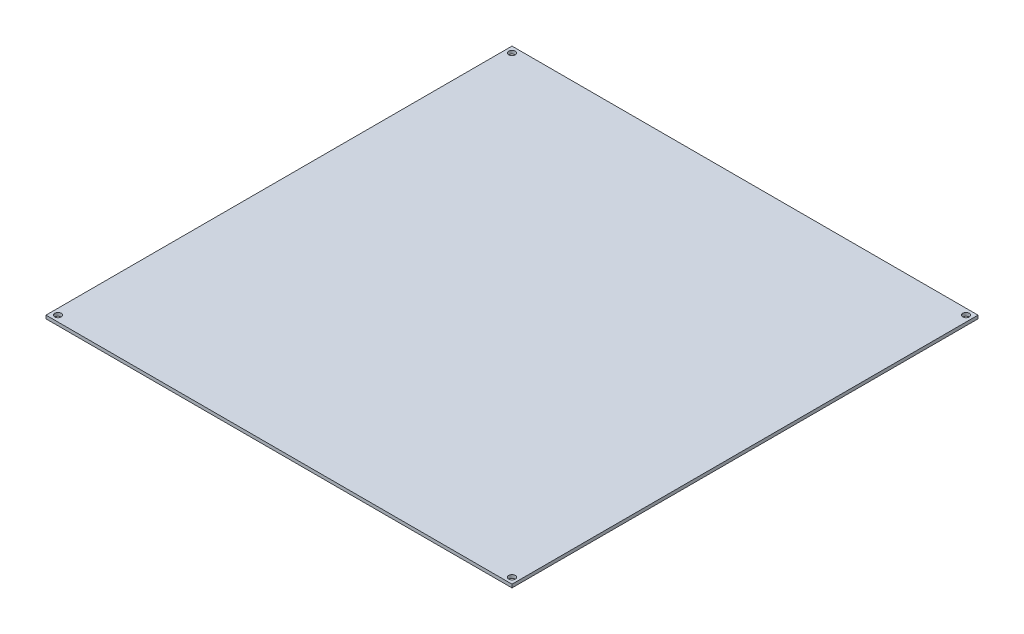
ISO-10303-21;
HEADER;
FILE_DESCRIPTION(('STEP AP214'),'2;1');
FILE_NAME('part.step','',(''),(''),'','','');
FILE_SCHEMA(('AUTOMOTIVE_DESIGN { 1 0 10303 214 1 1 1 1 }'));
ENDSEC;
DATA;
#1=APPLICATION_CONTEXT('core data for automotive mechanical design processes');
#2=APPLICATION_PROTOCOL_DEFINITION('international standard','automotive_design',2000,#1);
#3=PRODUCT_CONTEXT('',#1,'mechanical');
#4=PRODUCT('Part','Part','',(#3));
#5=PRODUCT_RELATED_PRODUCT_CATEGORY('part','',(#4));
#6=PRODUCT_DEFINITION_FORMATION('','',#4);
#7=PRODUCT_DEFINITION_CONTEXT('part definition',#1,'design');
#8=PRODUCT_DEFINITION('design','',#6,#7);
#9=PRODUCT_DEFINITION_SHAPE('','',#8);
#10=(LENGTH_UNIT() NAMED_UNIT(*) SI_UNIT(.MILLI.,.METRE.));
#11=(NAMED_UNIT(*) PLANE_ANGLE_UNIT() SI_UNIT($,.RADIAN.));
#12=(NAMED_UNIT(*) SI_UNIT($,.STERADIAN.) SOLID_ANGLE_UNIT());
#13=UNCERTAINTY_MEASURE_WITH_UNIT(LENGTH_MEASURE(1.E-05),#10,'distance_accuracy_value','');
#14=(GEOMETRIC_REPRESENTATION_CONTEXT(3) GLOBAL_UNCERTAINTY_ASSIGNED_CONTEXT((#13)) GLOBAL_UNIT_ASSIGNED_CONTEXT((#10,
#11,#12)) REPRESENTATION_CONTEXT('',''));
#15=CARTESIAN_POINT('',(0.,0.,0.));
#16=DIRECTION('',(0.,0.,1.));
#17=DIRECTION('',(1.,0.,0.));
#18=AXIS2_PLACEMENT_3D('',#15,#16,#17);
#19=CARTESIAN_POINT('',(0.,0.75,0.));
#20=DIRECTION('',(0.,1.,0.));
#21=DIRECTION('',(0.,0.,1.));
#22=AXIS2_PLACEMENT_3D('',#19,#20,#21);
#23=PLANE('',#22);
#24=CARTESIAN_POINT('',(104.25,0.75,104.25));
#25=DIRECTION('',(0.,1.,0.));
#26=DIRECTION('',(0.,0.,-1.));
#27=AXIS2_PLACEMENT_3D('',#24,#25,#26);
#28=CIRCLE('',#27,1.5);
#29=CARTESIAN_POINT('',(104.25,0.75,102.75));
#30=VERTEX_POINT('',#29);
#31=EDGE_CURVE('E123',#30,#30,#28,.T.);
#32=ORIENTED_EDGE('',*,*,#31,.F.);
#33=EDGE_LOOP('',(#32));
#34=FACE_BOUND('',#33,.T.);
#35=CARTESIAN_POINT('',(104.25,0.75,-104.25));
#36=DIRECTION('',(0.,1.,0.));
#37=DIRECTION('',(0.,0.,1.));
#38=AXIS2_PLACEMENT_3D('',#35,#36,#37);
#39=CIRCLE('',#38,1.5);
#40=CARTESIAN_POINT('',(104.25,0.75,-102.75));
#41=VERTEX_POINT('',#40);
#42=EDGE_CURVE('E102',#41,#41,#39,.T.);
#43=ORIENTED_EDGE('',*,*,#42,.F.);
#44=EDGE_LOOP('',(#43));
#45=FACE_BOUND('',#44,.T.);
#46=DIRECTION('',(0.,0.,-1.));
#47=VECTOR('',#46,1.);
#48=CARTESIAN_POINT('',(107.,0.75,-107.));
#49=LINE('',#48,#47);
#50=CARTESIAN_POINT('',(107.,0.75,107.));
#51=VERTEX_POINT('',#50);
#52=CARTESIAN_POINT('',(107.,0.75,-107.));
#53=VERTEX_POINT('',#52);
#54=EDGE_CURVE('E87',#51,#53,#49,.T.);
#55=ORIENTED_EDGE('',*,*,#54,.T.);
#56=DIRECTION('',(-1.,0.,0.));
#57=VECTOR('',#56,1.);
#58=CARTESIAN_POINT('',(-107.,0.75,-107.));
#59=LINE('',#58,#57);
#60=CARTESIAN_POINT('',(-107.,0.75,-107.));
#61=VERTEX_POINT('',#60);
#62=EDGE_CURVE('E82',#53,#61,#59,.T.);
#63=ORIENTED_EDGE('',*,*,#62,.T.);
#64=DIRECTION('',(0.,0.,1.));
#65=VECTOR('',#64,1.);
#66=CARTESIAN_POINT('',(-107.,0.75,-107.));
#67=LINE('',#66,#65);
#68=CARTESIAN_POINT('',(-107.,0.75,107.));
#69=VERTEX_POINT('',#68);
#70=EDGE_CURVE('E85',#61,#69,#67,.T.);
#71=ORIENTED_EDGE('',*,*,#70,.T.);
#72=DIRECTION('',(1.,0.,0.));
#73=VECTOR('',#72,1.);
#74=CARTESIAN_POINT('',(-107.,0.75,107.));
#75=LINE('',#74,#73);
#76=EDGE_CURVE('E52',#69,#51,#75,.T.);
#77=ORIENTED_EDGE('',*,*,#76,.T.);
#78=EDGE_LOOP('',(#55,#63,#71,#77));
#79=FACE_BOUND('',#78,.T.);
#80=CARTESIAN_POINT('',(-104.25,0.75,-104.25));
#81=DIRECTION('',(0.,1.,0.));
#82=DIRECTION('',(0.,0.,-1.));
#83=AXIS2_PLACEMENT_3D('',#80,#81,#82);
#84=CIRCLE('',#83,1.5);
#85=CARTESIAN_POINT('',(-104.25,0.75,-105.75));
#86=VERTEX_POINT('',#85);
#87=EDGE_CURVE('E117',#86,#86,#84,.T.);
#88=ORIENTED_EDGE('',*,*,#87,.F.);
#89=EDGE_LOOP('',(#88));
#90=FACE_BOUND('',#89,.T.);
#91=CARTESIAN_POINT('',(-104.25,0.75,104.25));
#92=DIRECTION('',(0.,1.,0.));
#93=DIRECTION('',(0.,0.,1.));
#94=AXIS2_PLACEMENT_3D('',#91,#92,#93);
#95=CIRCLE('',#94,1.5);
#96=CARTESIAN_POINT('',(-104.25,0.75,105.75));
#97=VERTEX_POINT('',#96);
#98=EDGE_CURVE('E129',#97,#97,#95,.T.);
#99=ORIENTED_EDGE('',*,*,#98,.F.);
#100=EDGE_LOOP('',(#99));
#101=FACE_BOUND('',#100,.T.);
#102=ADVANCED_FACE('F35',(#34,#45,#79,#90,#101),#23,.T.);
#103=CARTESIAN_POINT('',(0.,-0.75,0.));
#104=DIRECTION('',(0.,1.,0.));
#105=DIRECTION('',(0.,0.,1.));
#106=AXIS2_PLACEMENT_3D('',#103,#104,#105);
#107=PLANE('',#106);
#108=DIRECTION('',(0.,0.,-1.));
#109=VECTOR('',#108,1.);
#110=CARTESIAN_POINT('',(107.,-0.75,-107.));
#111=LINE('',#110,#109);
#112=CARTESIAN_POINT('',(107.,-0.75,107.));
#113=VERTEX_POINT('',#112);
#114=CARTESIAN_POINT('',(107.,-0.75,-107.));
#115=VERTEX_POINT('',#114);
#116=EDGE_CURVE('E99',#113,#115,#111,.T.);
#117=ORIENTED_EDGE('',*,*,#116,.F.);
#118=DIRECTION('',(1.,0.,0.));
#119=VECTOR('',#118,1.);
#120=CARTESIAN_POINT('',(-107.,-0.75,107.));
#121=LINE('',#120,#119);
#122=CARTESIAN_POINT('',(-107.,-0.75,107.));
#123=VERTEX_POINT('',#122);
#124=EDGE_CURVE('E75',#123,#113,#121,.T.);
#125=ORIENTED_EDGE('',*,*,#124,.F.);
#126=DIRECTION('',(0.,0.,1.));
#127=VECTOR('',#126,1.);
#128=CARTESIAN_POINT('',(-107.,-0.75,-107.));
#129=LINE('',#128,#127);
#130=CARTESIAN_POINT('',(-107.,-0.75,-107.));
#131=VERTEX_POINT('',#130);
#132=EDGE_CURVE('E69',#131,#123,#129,.T.);
#133=ORIENTED_EDGE('',*,*,#132,.F.);
#134=DIRECTION('',(-1.,0.,0.));
#135=VECTOR('',#134,1.);
#136=CARTESIAN_POINT('',(-107.,-0.75,-107.));
#137=LINE('',#136,#135);
#138=EDGE_CURVE('E91',#115,#131,#137,.T.);
#139=ORIENTED_EDGE('',*,*,#138,.F.);
#140=EDGE_LOOP('',(#117,#125,#133,#139));
#141=FACE_BOUND('',#140,.T.);
#142=CARTESIAN_POINT('',(104.25,-0.75,-104.25));
#143=DIRECTION('',(0.,1.,0.));
#144=DIRECTION('',(0.,0.,1.));
#145=AXIS2_PLACEMENT_3D('',#142,#143,#144);
#146=CIRCLE('',#145,1.5);
#147=CARTESIAN_POINT('',(104.25,-0.75,-102.75));
#148=VERTEX_POINT('',#147);
#149=EDGE_CURVE('E114',#148,#148,#146,.T.);
#150=ORIENTED_EDGE('',*,*,#149,.T.);
#151=EDGE_LOOP('',(#150));
#152=FACE_BOUND('',#151,.T.);
#153=CARTESIAN_POINT('',(-104.25,-0.75,-104.25));
#154=DIRECTION('',(0.,1.,0.));
#155=DIRECTION('',(0.,0.,-1.));
#156=AXIS2_PLACEMENT_3D('',#153,#154,#155);
#157=CIRCLE('',#156,1.5);
#158=CARTESIAN_POINT('',(-104.25,-0.75,-105.75));
#159=VERTEX_POINT('',#158);
#160=EDGE_CURVE('E120',#159,#159,#157,.T.);
#161=ORIENTED_EDGE('',*,*,#160,.T.);
#162=EDGE_LOOP('',(#161));
#163=FACE_BOUND('',#162,.T.);
#164=CARTESIAN_POINT('',(104.25,-0.75,104.25));
#165=DIRECTION('',(0.,1.,0.));
#166=DIRECTION('',(0.,0.,-1.));
#167=AXIS2_PLACEMENT_3D('',#164,#165,#166);
#168=CIRCLE('',#167,1.5);
#169=CARTESIAN_POINT('',(104.25,-0.75,102.75));
#170=VERTEX_POINT('',#169);
#171=EDGE_CURVE('E126',#170,#170,#168,.T.);
#172=ORIENTED_EDGE('',*,*,#171,.T.);
#173=EDGE_LOOP('',(#172));
#174=FACE_BOUND('',#173,.T.);
#175=CARTESIAN_POINT('',(-104.25,-0.75,104.25));
#176=DIRECTION('',(0.,1.,0.));
#177=DIRECTION('',(0.,0.,1.));
#178=AXIS2_PLACEMENT_3D('',#175,#176,#177);
#179=CIRCLE('',#178,1.5);
#180=CARTESIAN_POINT('',(-104.25,-0.75,105.75));
#181=VERTEX_POINT('',#180);
#182=EDGE_CURVE('E132',#181,#181,#179,.T.);
#183=ORIENTED_EDGE('',*,*,#182,.T.);
#184=EDGE_LOOP('',(#183));
#185=FACE_BOUND('',#184,.T.);
#186=ADVANCED_FACE('F110',(#141,#152,#163,#174,#185),#107,.F.);
#187=CARTESIAN_POINT('',(107.,0.75,-107.));
#188=DIRECTION('',(-1.,0.,0.));
#189=DIRECTION('',(0.,0.,1.));
#190=AXIS2_PLACEMENT_3D('',#187,#188,#189);
#191=PLANE('',#190);
#192=ORIENTED_EDGE('',*,*,#116,.T.);
#193=DIRECTION('',(0.,-1.,0.));
#194=VECTOR('',#193,1.);
#195=CARTESIAN_POINT('',(107.,0.75,-107.));
#196=LINE('',#195,#194);
#197=EDGE_CURVE('E11',#53,#115,#196,.T.);
#198=ORIENTED_EDGE('',*,*,#197,.F.);
#199=ORIENTED_EDGE('',*,*,#54,.F.);
#200=DIRECTION('',(0.,-1.,0.));
#201=VECTOR('',#200,1.);
#202=CARTESIAN_POINT('',(107.,0.75,107.));
#203=LINE('',#202,#201);
#204=EDGE_CURVE('E95',#51,#113,#203,.T.);
#205=ORIENTED_EDGE('',*,*,#204,.T.);
#206=EDGE_LOOP('',(#192,#198,#199,#205));
#207=FACE_BOUND('',#206,.T.);
#208=ADVANCED_FACE('F37',(#207),#191,.F.);
#209=CARTESIAN_POINT('',(-107.,0.75,-107.));
#210=DIRECTION('',(0.,0.,1.));
#211=DIRECTION('',(1.,0.,0.));
#212=AXIS2_PLACEMENT_3D('',#209,#210,#211);
#213=PLANE('',#212);
#214=ORIENTED_EDGE('',*,*,#138,.T.);
#215=DIRECTION('',(0.,-1.,0.));
#216=VECTOR('',#215,1.);
#217=CARTESIAN_POINT('',(-107.,0.75,-107.));
#218=LINE('',#217,#216);
#219=EDGE_CURVE('E44',#61,#131,#218,.T.);
#220=ORIENTED_EDGE('',*,*,#219,.F.);
#221=ORIENTED_EDGE('',*,*,#62,.F.);
#222=ORIENTED_EDGE('',*,*,#197,.T.);
#223=EDGE_LOOP('',(#214,#220,#221,#222));
#224=FACE_BOUND('',#223,.T.);
#225=ADVANCED_FACE('F90',(#224),#213,.F.);
#226=CARTESIAN_POINT('',(-107.,0.75,-107.));
#227=DIRECTION('',(1.,0.,0.));
#228=DIRECTION('',(0.,0.,-1.));
#229=AXIS2_PLACEMENT_3D('',#226,#227,#228);
#230=PLANE('',#229);
#231=ORIENTED_EDGE('',*,*,#132,.T.);
#232=DIRECTION('',(0.,-1.,0.));
#233=VECTOR('',#232,1.);
#234=CARTESIAN_POINT('',(-107.,0.75,107.));
#235=LINE('',#234,#233);
#236=EDGE_CURVE('E92',#69,#123,#235,.T.);
#237=ORIENTED_EDGE('',*,*,#236,.F.);
#238=ORIENTED_EDGE('',*,*,#70,.F.);
#239=ORIENTED_EDGE('',*,*,#219,.T.);
#240=EDGE_LOOP('',(#231,#237,#238,#239));
#241=FACE_BOUND('',#240,.T.);
#242=ADVANCED_FACE('F93',(#241),#230,.F.);
#243=CARTESIAN_POINT('',(-107.,0.75,107.));
#244=DIRECTION('',(0.,0.,-1.));
#245=DIRECTION('',(-1.,0.,0.));
#246=AXIS2_PLACEMENT_3D('',#243,#244,#245);
#247=PLANE('',#246);
#248=ORIENTED_EDGE('',*,*,#124,.T.);
#249=ORIENTED_EDGE('',*,*,#204,.F.);
#250=ORIENTED_EDGE('',*,*,#76,.F.);
#251=ORIENTED_EDGE('',*,*,#236,.T.);
#252=EDGE_LOOP('',(#248,#249,#250,#251));
#253=FACE_BOUND('',#252,.T.);
#254=ADVANCED_FACE('F107',(#253),#247,.F.);
#255=CARTESIAN_POINT('',(104.25,0.75,-104.25));
#256=DIRECTION('',(0.,-1.,0.));
#257=DIRECTION('',(0.,0.,-1.));
#258=AXIS2_PLACEMENT_3D('',#255,#256,#257);
#259=CYLINDRICAL_SURFACE('',#258,1.5);
#260=ORIENTED_EDGE('',*,*,#42,.T.);
#261=EDGE_LOOP('',(#260));
#262=FACE_BOUND('',#261,.T.);
#263=ORIENTED_EDGE('',*,*,#149,.F.);
#264=EDGE_LOOP('',(#263));
#265=FACE_BOUND('',#264,.T.);
#266=ADVANCED_FACE('F151',(#262,#265),#259,.F.);
#267=CARTESIAN_POINT('',(-104.25,0.75,-104.25));
#268=DIRECTION('',(0.,-1.,0.));
#269=DIRECTION('',(0.,0.,-1.));
#270=AXIS2_PLACEMENT_3D('',#267,#268,#269);
#271=CYLINDRICAL_SURFACE('',#270,1.5);
#272=ORIENTED_EDGE('',*,*,#87,.T.);
#273=EDGE_LOOP('',(#272));
#274=FACE_BOUND('',#273,.T.);
#275=ORIENTED_EDGE('',*,*,#160,.F.);
#276=EDGE_LOOP('',(#275));
#277=FACE_BOUND('',#276,.T.);
#278=ADVANCED_FACE('F197',(#274,#277),#271,.F.);
#279=CARTESIAN_POINT('',(104.25,0.75,104.25));
#280=DIRECTION('',(0.,-1.,0.));
#281=DIRECTION('',(0.,0.,-1.));
#282=AXIS2_PLACEMENT_3D('',#279,#280,#281);
#283=CYLINDRICAL_SURFACE('',#282,1.5);
#284=ORIENTED_EDGE('',*,*,#31,.T.);
#285=EDGE_LOOP('',(#284));
#286=FACE_BOUND('',#285,.T.);
#287=ORIENTED_EDGE('',*,*,#171,.F.);
#288=EDGE_LOOP('',(#287));
#289=FACE_BOUND('',#288,.T.);
#290=ADVANCED_FACE('F205',(#286,#289),#283,.F.);
#291=CARTESIAN_POINT('',(-104.25,0.75,104.25));
#292=DIRECTION('',(0.,-1.,0.));
#293=DIRECTION('',(0.,0.,-1.));
#294=AXIS2_PLACEMENT_3D('',#291,#292,#293);
#295=CYLINDRICAL_SURFACE('',#294,1.5);
#296=ORIENTED_EDGE('',*,*,#98,.T.);
#297=EDGE_LOOP('',(#296));
#298=FACE_BOUND('',#297,.T.);
#299=ORIENTED_EDGE('',*,*,#182,.F.);
#300=EDGE_LOOP('',(#299));
#301=FACE_BOUND('',#300,.T.);
#302=ADVANCED_FACE('F138',(#298,#301),#295,.F.);
#303=CLOSED_SHELL('',(#102,#186,#208,#225,#242,#254,#266,#278,#290,#302));
#304=MANIFOLD_SOLID_BREP('B2',#303);
#305=ADVANCED_BREP_SHAPE_REPRESENTATION('',(#18,#304),#14);
#306=SHAPE_DEFINITION_REPRESENTATION(#9,#305);
ENDSEC;
END-ISO-10303-21;
